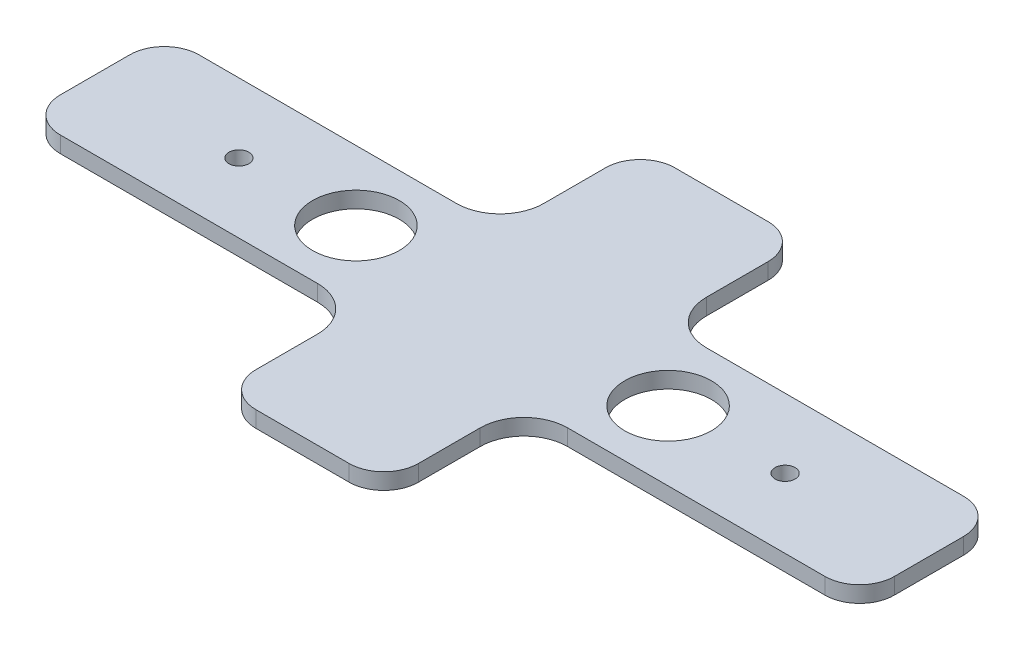
ISO-10303-21;
HEADER;
FILE_DESCRIPTION(('STEP AP214'),'2;1');
FILE_NAME('part.step','',(''),(''),'','','');
FILE_SCHEMA(('AUTOMOTIVE_DESIGN { 1 0 10303 214 1 1 1 1 }'));
ENDSEC;
DATA;
#1=APPLICATION_CONTEXT('core data for automotive mechanical design processes');
#2=APPLICATION_PROTOCOL_DEFINITION('international standard','automotive_design',2000,#1);
#3=PRODUCT_CONTEXT('',#1,'mechanical');
#4=PRODUCT('Part','Part','',(#3));
#5=PRODUCT_RELATED_PRODUCT_CATEGORY('part','',(#4));
#6=PRODUCT_DEFINITION_FORMATION('','',#4);
#7=PRODUCT_DEFINITION_CONTEXT('part definition',#1,'design');
#8=PRODUCT_DEFINITION('design','',#6,#7);
#9=PRODUCT_DEFINITION_SHAPE('','',#8);
#10=(LENGTH_UNIT() NAMED_UNIT(*) SI_UNIT(.MILLI.,.METRE.));
#11=(NAMED_UNIT(*) PLANE_ANGLE_UNIT() SI_UNIT($,.RADIAN.));
#12=(NAMED_UNIT(*) SI_UNIT($,.STERADIAN.) SOLID_ANGLE_UNIT());
#13=UNCERTAINTY_MEASURE_WITH_UNIT(LENGTH_MEASURE(1.E-05),#10,'distance_accuracy_value','');
#14=(GEOMETRIC_REPRESENTATION_CONTEXT(3) GLOBAL_UNCERTAINTY_ASSIGNED_CONTEXT((#13)) GLOBAL_UNIT_ASSIGNED_CONTEXT((#10,
#11,#12)) REPRESENTATION_CONTEXT('',''));
#15=CARTESIAN_POINT('',(0.,0.,0.));
#16=DIRECTION('',(0.,0.,1.));
#17=DIRECTION('',(1.,0.,0.));
#18=AXIS2_PLACEMENT_3D('',#15,#16,#17);
#19=CARTESIAN_POINT('',(0.,90.5002,143.155943707725));
#20=DIRECTION('',(0.,0.,1.));
#21=DIRECTION('',(1.,0.,0.));
#22=AXIS2_PLACEMENT_3D('',#19,#20,#21);
#23=PLANE('',#22);
#24=DIRECTION('',(1.,0.,0.));
#25=VECTOR('',#24,1.);
#26=CARTESIAN_POINT('',(0.,93.472,143.155943707725));
#27=LINE('',#26,#25);
#28=CARTESIAN_POINT('',(-9.32304003720227,93.472,143.155943707725));
#29=VERTEX_POINT('',#28);
#30=CARTESIAN_POINT('',(7.73150051393097,93.472,143.155943707725));
#31=VERTEX_POINT('',#30);
#32=EDGE_CURVE('E273',#29,#31,#27,.T.);
#33=ORIENTED_EDGE('',*,*,#32,.T.);
#34=DIRECTION('',(0.,1.,0.));
#35=VECTOR('',#34,1.);
#36=CARTESIAN_POINT('',(7.73150051393097,90.5002,143.155943707725));
#37=LINE('',#36,#35);
#38=CARTESIAN_POINT('',(7.73150051393097,90.5002,143.155943707725));
#39=VERTEX_POINT('',#38);
#40=EDGE_CURVE('E211',#39,#31,#37,.T.);
#41=ORIENTED_EDGE('',*,*,#40,.F.);
#42=DIRECTION('',(1.,0.,0.));
#43=VECTOR('',#42,1.);
#44=CARTESIAN_POINT('',(0.,90.5002,143.155943707725));
#45=LINE('',#44,#43);
#46=CARTESIAN_POINT('',(-9.32304003720227,90.5002,143.155943707725));
#47=VERTEX_POINT('',#46);
#48=EDGE_CURVE('E210',#47,#39,#45,.T.);
#49=ORIENTED_EDGE('',*,*,#48,.F.);
#50=DIRECTION('',(0.,1.,0.));
#51=VECTOR('',#50,1.);
#52=CARTESIAN_POINT('',(-9.32304003720227,90.5002,143.155943707725));
#53=LINE('',#52,#51);
#54=EDGE_CURVE('E195',#47,#29,#53,.T.);
#55=ORIENTED_EDGE('',*,*,#54,.T.);
#56=EDGE_LOOP('',(#33,#41,#49,#55));
#57=FACE_BOUND('',#56,.T.);
#58=ADVANCED_FACE('F34',(#57),#23,.F.);
#59=CARTESIAN_POINT('',(7.73150051393097,90.5002,149.505943707725));
#60=DIRECTION('',(0.,1.,0.));
#61=DIRECTION('',(0.,0.,1.));
#62=AXIS2_PLACEMENT_3D('',#59,#60,#61);
#63=CYLINDRICAL_SURFACE('',#62,6.35);
#64=CARTESIAN_POINT('',(7.73150051393097,93.472,149.505943707725));
#65=DIRECTION('',(0.,1.,0.));
#66=DIRECTION('',(0.,0.,1.));
#67=AXIS2_PLACEMENT_3D('',#64,#65,#66);
#68=CIRCLE('',#67,6.35);
#69=CARTESIAN_POINT('',(14.081500513931,93.472,149.505943707725));
#70=VERTEX_POINT('',#69);
#71=EDGE_CURVE('E319',#70,#31,#68,.T.);
#72=ORIENTED_EDGE('',*,*,#71,.F.);
#73=DIRECTION('',(0.,1.,0.));
#74=VECTOR('',#73,1.);
#75=CARTESIAN_POINT('',(14.081500513931,90.5002,149.505943707725));
#76=LINE('',#75,#74);
#77=CARTESIAN_POINT('',(14.081500513931,90.5002,149.505943707725));
#78=VERTEX_POINT('',#77);
#79=EDGE_CURVE('E325',#78,#70,#76,.T.);
#80=ORIENTED_EDGE('',*,*,#79,.F.);
#81=CARTESIAN_POINT('',(7.73150051393097,90.5002,149.505943707725));
#82=DIRECTION('',(0.,1.,0.));
#83=DIRECTION('',(0.,0.,1.));
#84=AXIS2_PLACEMENT_3D('',#81,#82,#83);
#85=CIRCLE('',#84,6.35);
#86=EDGE_CURVE('E207',#78,#39,#85,.T.);
#87=ORIENTED_EDGE('',*,*,#86,.T.);
#88=ORIENTED_EDGE('',*,*,#40,.T.);
#89=EDGE_LOOP('',(#72,#80,#87,#88));
#90=FACE_BOUND('',#89,.T.);
#91=ADVANCED_FACE('F435',(#90),#63,.T.);
#92=CARTESIAN_POINT('',(14.081500513931,90.5002,0.));
#93=DIRECTION('',(-1.,0.,0.));
#94=DIRECTION('',(0.,0.,1.));
#95=AXIS2_PLACEMENT_3D('',#92,#93,#94);
#96=PLANE('',#95);
#97=DIRECTION('',(0.,0.,1.));
#98=VECTOR('',#97,1.);
#99=CARTESIAN_POINT('',(14.081500513931,93.472,0.));
#100=LINE('',#99,#98);
#101=CARTESIAN_POINT('',(14.081500513931,93.472,160.805943707725));
#102=VERTEX_POINT('',#101);
#103=EDGE_CURVE('E316',#70,#102,#100,.T.);
#104=ORIENTED_EDGE('',*,*,#103,.T.);
#105=DIRECTION('',(0.,1.,0.));
#106=VECTOR('',#105,1.);
#107=CARTESIAN_POINT('',(14.081500513931,90.5002,160.805943707725));
#108=LINE('',#107,#106);
#109=CARTESIAN_POINT('',(14.081500513931,90.5002,160.805943707725));
#110=VERTEX_POINT('',#109);
#111=EDGE_CURVE('E365',#102,#110,#108,.F.);
#112=ORIENTED_EDGE('',*,*,#111,.T.);
#113=DIRECTION('',(0.,0.,1.));
#114=VECTOR('',#113,1.);
#115=CARTESIAN_POINT('',(14.081500513931,90.5002,0.));
#116=LINE('',#115,#114);
#117=EDGE_CURVE('E262',#78,#110,#116,.T.);
#118=ORIENTED_EDGE('',*,*,#117,.F.);
#119=ORIENTED_EDGE('',*,*,#79,.T.);
#120=EDGE_LOOP('',(#104,#112,#118,#119));
#121=FACE_BOUND('',#120,.T.);
#122=ADVANCED_FACE('F430',(#121),#96,.F.);
#123=CARTESIAN_POINT('',(0.,90.5002,168.805943707725));
#124=DIRECTION('',(0.,0.,1.));
#125=DIRECTION('',(1.,0.,0.));
#126=AXIS2_PLACEMENT_3D('',#123,#124,#125);
#127=PLANE('',#126);
#128=DIRECTION('',(1.,0.,0.));
#129=VECTOR('',#128,1.);
#130=CARTESIAN_POINT('',(0.,90.5002,168.805943707725));
#131=LINE('',#130,#129);
#132=CARTESIAN_POINT('',(22.081500513931,90.5002,168.805943707725));
#133=VERTEX_POINT('',#132);
#134=CARTESIAN_POINT('',(69.2042302383644,90.5002,168.805943707725));
#135=VERTEX_POINT('',#134);
#136=EDGE_CURVE('E260',#133,#135,#131,.T.);
#137=ORIENTED_EDGE('',*,*,#136,.F.);
#138=DIRECTION('',(0.,1.,0.));
#139=VECTOR('',#138,1.);
#140=CARTESIAN_POINT('',(22.081500513931,93.472,168.805943707725));
#141=LINE('',#140,#139);
#142=CARTESIAN_POINT('',(22.081500513931,93.472,168.805943707725));
#143=VERTEX_POINT('',#142);
#144=EDGE_CURVE('E362',#133,#143,#141,.T.);
#145=ORIENTED_EDGE('',*,*,#144,.T.);
#146=DIRECTION('',(1.,0.,0.));
#147=VECTOR('',#146,1.);
#148=CARTESIAN_POINT('',(0.,93.472,168.805943707725));
#149=LINE('',#148,#147);
#150=CARTESIAN_POINT('',(69.2042302383644,93.472,168.805943707725));
#151=VERTEX_POINT('',#150);
#152=EDGE_CURVE('E314',#143,#151,#149,.T.);
#153=ORIENTED_EDGE('',*,*,#152,.T.);
#154=DIRECTION('',(0.,1.,0.));
#155=VECTOR('',#154,1.);
#156=CARTESIAN_POINT('',(69.2042302383644,90.5002,168.805943707725));
#157=LINE('',#156,#155);
#158=EDGE_CURVE('E327',#135,#151,#157,.T.);
#159=ORIENTED_EDGE('',*,*,#158,.F.);
#160=EDGE_LOOP('',(#137,#145,#153,#159));
#161=FACE_BOUND('',#160,.T.);
#162=ADVANCED_FACE('F423',(#161),#127,.F.);
#163=CARTESIAN_POINT('',(69.2042302383644,90.5002,175.155943707725));
#164=DIRECTION('',(0.,1.,0.));
#165=DIRECTION('',(0.,0.,1.));
#166=AXIS2_PLACEMENT_3D('',#163,#164,#165);
#167=CYLINDRICAL_SURFACE('',#166,6.34999999999999);
#168=CARTESIAN_POINT('',(69.2042302383644,93.472,175.155943707725));
#169=DIRECTION('',(0.,1.,0.));
#170=DIRECTION('',(0.,0.,1.));
#171=AXIS2_PLACEMENT_3D('',#168,#169,#170);
#172=CIRCLE('',#171,6.34999999999999);
#173=CARTESIAN_POINT('',(75.5542302383644,93.472,175.155943707725));
#174=VERTEX_POINT('',#173);
#175=EDGE_CURVE('E312',#151,#174,#172,.F.);
#176=ORIENTED_EDGE('',*,*,#175,.T.);
#177=DIRECTION('',(0.,1.,0.));
#178=VECTOR('',#177,1.);
#179=CARTESIAN_POINT('',(75.5542302383644,90.5002,175.155943707725));
#180=LINE('',#179,#178);
#181=CARTESIAN_POINT('',(75.5542302383644,90.5002,175.155943707725));
#182=VERTEX_POINT('',#181);
#183=EDGE_CURVE('E330',#182,#174,#180,.T.);
#184=ORIENTED_EDGE('',*,*,#183,.F.);
#185=CARTESIAN_POINT('',(69.2042302383644,90.5002,175.155943707725));
#186=DIRECTION('',(0.,1.,0.));
#187=DIRECTION('',(0.,0.,1.));
#188=AXIS2_PLACEMENT_3D('',#185,#186,#187);
#189=CIRCLE('',#188,6.34999999999999);
#190=EDGE_CURVE('E258',#135,#182,#189,.F.);
#191=ORIENTED_EDGE('',*,*,#190,.F.);
#192=ORIENTED_EDGE('',*,*,#158,.T.);
#193=EDGE_LOOP('',(#176,#184,#191,#192));
#194=FACE_BOUND('',#193,.T.);
#195=ADVANCED_FACE('F419',(#194),#167,.T.);
#196=CARTESIAN_POINT('',(75.5542302383646,90.5002,0.));
#197=DIRECTION('',(-1.,0.,0.));
#198=DIRECTION('',(0.,0.,1.));
#199=AXIS2_PLACEMENT_3D('',#196,#197,#198);
#200=PLANE('',#199);
#201=DIRECTION('',(0.,0.,1.));
#202=VECTOR('',#201,1.);
#203=CARTESIAN_POINT('',(75.5542302383646,93.472,0.));
#204=LINE('',#203,#202);
#205=CARTESIAN_POINT('',(75.5542302383644,93.472,187.855943707725));
#206=VERTEX_POINT('',#205);
#207=EDGE_CURVE('E310',#174,#206,#204,.T.);
#208=ORIENTED_EDGE('',*,*,#207,.T.);
#209=DIRECTION('',(0.,1.,0.));
#210=VECTOR('',#209,1.);
#211=CARTESIAN_POINT('',(75.5542302383644,90.5002,187.855943707725));
#212=LINE('',#211,#210);
#213=CARTESIAN_POINT('',(75.5542302383644,90.5002,187.855943707725));
#214=VERTEX_POINT('',#213);
#215=EDGE_CURVE('E333',#214,#206,#212,.T.);
#216=ORIENTED_EDGE('',*,*,#215,.F.);
#217=DIRECTION('',(0.,0.,1.));
#218=VECTOR('',#217,1.);
#219=CARTESIAN_POINT('',(75.5542302383646,90.5002,0.));
#220=LINE('',#219,#218);
#221=EDGE_CURVE('E256',#182,#214,#220,.T.);
#222=ORIENTED_EDGE('',*,*,#221,.F.);
#223=ORIENTED_EDGE('',*,*,#183,.T.);
#224=EDGE_LOOP('',(#208,#216,#222,#223));
#225=FACE_BOUND('',#224,.T.);
#226=ADVANCED_FACE('F414',(#225),#200,.F.);
#227=CARTESIAN_POINT('',(69.2042302383644,90.5002,187.855943707725));
#228=DIRECTION('',(0.,1.,0.));
#229=DIRECTION('',(0.,0.,1.));
#230=AXIS2_PLACEMENT_3D('',#227,#228,#229);
#231=CYLINDRICAL_SURFACE('',#230,6.34999999999999);
#232=CARTESIAN_POINT('',(69.2042302383644,93.472,187.855943707725));
#233=DIRECTION('',(0.,1.,0.));
#234=DIRECTION('',(0.,0.,1.));
#235=AXIS2_PLACEMENT_3D('',#232,#233,#234);
#236=CIRCLE('',#235,6.34999999999999);
#237=CARTESIAN_POINT('',(69.2042302383644,93.472,194.205943707725));
#238=VERTEX_POINT('',#237);
#239=EDGE_CURVE('E308',#206,#238,#236,.F.);
#240=ORIENTED_EDGE('',*,*,#239,.T.);
#241=DIRECTION('',(0.,1.,0.));
#242=VECTOR('',#241,1.);
#243=CARTESIAN_POINT('',(69.2042302383644,90.5002,194.205943707725));
#244=LINE('',#243,#242);
#245=CARTESIAN_POINT('',(69.2042302383644,90.5002,194.205943707725));
#246=VERTEX_POINT('',#245);
#247=EDGE_CURVE('E336',#246,#238,#244,.T.);
#248=ORIENTED_EDGE('',*,*,#247,.F.);
#249=CARTESIAN_POINT('',(69.2042302383644,90.5002,187.855943707725));
#250=DIRECTION('',(0.,1.,0.));
#251=DIRECTION('',(0.,0.,1.));
#252=AXIS2_PLACEMENT_3D('',#249,#250,#251);
#253=CIRCLE('',#252,6.34999999999999);
#254=EDGE_CURVE('E254',#214,#246,#253,.F.);
#255=ORIENTED_EDGE('',*,*,#254,.F.);
#256=ORIENTED_EDGE('',*,*,#215,.T.);
#257=EDGE_LOOP('',(#240,#248,#255,#256));
#258=FACE_BOUND('',#257,.T.);
#259=ADVANCED_FACE('F408',(#258),#231,.T.);
#260=CARTESIAN_POINT('',(0.,90.5002,194.205943707725));
#261=DIRECTION('',(0.,0.,-1.));
#262=DIRECTION('',(-1.,0.,0.));
#263=AXIS2_PLACEMENT_3D('',#260,#261,#262);
#264=PLANE('',#263);
#265=DIRECTION('',(-1.,0.,0.));
#266=VECTOR('',#265,1.);
#267=CARTESIAN_POINT('',(0.,93.472,194.205943707725));
#268=LINE('',#267,#266);
#269=CARTESIAN_POINT('',(22.081500513931,93.472,194.205943707725));
#270=VERTEX_POINT('',#269);
#271=EDGE_CURVE('E305',#238,#270,#268,.T.);
#272=ORIENTED_EDGE('',*,*,#271,.T.);
#273=DIRECTION('',(0.,1.,0.));
#274=VECTOR('',#273,1.);
#275=CARTESIAN_POINT('',(22.081500513931,90.5002,194.205943707725));
#276=LINE('',#275,#274);
#277=CARTESIAN_POINT('',(22.081500513931,90.5002,194.205943707725));
#278=VERTEX_POINT('',#277);
#279=EDGE_CURVE('E370',#270,#278,#276,.F.);
#280=ORIENTED_EDGE('',*,*,#279,.T.);
#281=DIRECTION('',(-1.,0.,0.));
#282=VECTOR('',#281,1.);
#283=CARTESIAN_POINT('',(0.,90.5002,194.205943707725));
#284=LINE('',#283,#282);
#285=EDGE_CURVE('E251',#246,#278,#284,.T.);
#286=ORIENTED_EDGE('',*,*,#285,.F.);
#287=ORIENTED_EDGE('',*,*,#247,.T.);
#288=EDGE_LOOP('',(#272,#280,#286,#287));
#289=FACE_BOUND('',#288,.T.);
#290=ADVANCED_FACE('F404',(#289),#264,.F.);
#291=CARTESIAN_POINT('',(14.0815005139309,90.5002,0.));
#292=DIRECTION('',(-1.,0.,0.));
#293=DIRECTION('',(0.,0.,1.));
#294=AXIS2_PLACEMENT_3D('',#291,#292,#293);
#295=PLANE('',#294);
#296=DIRECTION('',(0.,0.,1.));
#297=VECTOR('',#296,1.);
#298=CARTESIAN_POINT('',(14.0815005139309,90.5002,0.));
#299=LINE('',#298,#297);
#300=CARTESIAN_POINT('',(14.081500513931,90.5002,202.205943707725));
#301=VERTEX_POINT('',#300);
#302=CARTESIAN_POINT('',(14.081500513931,90.5002,213.505943707725));
#303=VERTEX_POINT('',#302);
#304=EDGE_CURVE('E249',#301,#303,#299,.T.);
#305=ORIENTED_EDGE('',*,*,#304,.F.);
#306=DIRECTION('',(0.,1.,0.));
#307=VECTOR('',#306,1.);
#308=CARTESIAN_POINT('',(14.081500513931,93.472,202.205943707725));
#309=LINE('',#308,#307);
#310=CARTESIAN_POINT('',(14.081500513931,93.472,202.205943707725));
#311=VERTEX_POINT('',#310);
#312=EDGE_CURVE('E367',#301,#311,#309,.T.);
#313=ORIENTED_EDGE('',*,*,#312,.T.);
#314=DIRECTION('',(0.,0.,1.));
#315=VECTOR('',#314,1.);
#316=CARTESIAN_POINT('',(14.0815005139309,93.472,0.));
#317=LINE('',#316,#315);
#318=CARTESIAN_POINT('',(14.081500513931,93.472,213.505943707725));
#319=VERTEX_POINT('',#318);
#320=EDGE_CURVE('E303',#311,#319,#317,.T.);
#321=ORIENTED_EDGE('',*,*,#320,.T.);
#322=DIRECTION('',(0.,1.,0.));
#323=VECTOR('',#322,1.);
#324=CARTESIAN_POINT('',(14.081500513931,90.5002,213.505943707725));
#325=LINE('',#324,#323);
#326=EDGE_CURVE('E339',#303,#319,#325,.T.);
#327=ORIENTED_EDGE('',*,*,#326,.F.);
#328=EDGE_LOOP('',(#305,#313,#321,#327));
#329=FACE_BOUND('',#328,.T.);
#330=ADVANCED_FACE('F395',(#329),#295,.F.);
#331=CARTESIAN_POINT('',(7.73150051393097,90.5002,213.505943707725));
#332=DIRECTION('',(0.,1.,0.));
#333=DIRECTION('',(0.,0.,1.));
#334=AXIS2_PLACEMENT_3D('',#331,#332,#333);
#335=CYLINDRICAL_SURFACE('',#334,6.35);
#336=CARTESIAN_POINT('',(7.73150051393097,93.472,213.505943707725));
#337=DIRECTION('',(0.,1.,0.));
#338=DIRECTION('',(0.,0.,1.));
#339=AXIS2_PLACEMENT_3D('',#336,#337,#338);
#340=CIRCLE('',#339,6.35);
#341=CARTESIAN_POINT('',(7.73150051393097,93.472,219.855943707725));
#342=VERTEX_POINT('',#341);
#343=EDGE_CURVE('E300',#319,#342,#340,.F.);
#344=ORIENTED_EDGE('',*,*,#343,.T.);
#345=DIRECTION('',(0.,1.,0.));
#346=VECTOR('',#345,1.);
#347=CARTESIAN_POINT('',(7.73150051393097,90.5002,219.855943707725));
#348=LINE('',#347,#346);
#349=CARTESIAN_POINT('',(7.73150051393097,90.5002,219.855943707725));
#350=VERTEX_POINT('',#349);
#351=EDGE_CURVE('E342',#350,#342,#348,.T.);
#352=ORIENTED_EDGE('',*,*,#351,.F.);
#353=CARTESIAN_POINT('',(7.73150051393097,90.5002,213.505943707725));
#354=DIRECTION('',(0.,1.,0.));
#355=DIRECTION('',(0.,0.,1.));
#356=AXIS2_PLACEMENT_3D('',#353,#354,#355);
#357=CIRCLE('',#356,6.35);
#358=EDGE_CURVE('E247',#303,#350,#357,.F.);
#359=ORIENTED_EDGE('',*,*,#358,.F.);
#360=ORIENTED_EDGE('',*,*,#326,.T.);
#361=EDGE_LOOP('',(#344,#352,#359,#360));
#362=FACE_BOUND('',#361,.T.);
#363=ADVANCED_FACE('F478',(#362),#335,.T.);
#364=CARTESIAN_POINT('',(0.,90.5002,219.855943707725));
#365=DIRECTION('',(0.,0.,1.));
#366=DIRECTION('',(1.,0.,0.));
#367=AXIS2_PLACEMENT_3D('',#364,#365,#366);
#368=PLANE('',#367);
#369=DIRECTION('',(1.,0.,0.));
#370=VECTOR('',#369,1.);
#371=CARTESIAN_POINT('',(0.,93.472,219.855943707725));
#372=LINE('',#371,#370);
#373=CARTESIAN_POINT('',(-9.32304003720227,93.472,219.855943707725));
#374=VERTEX_POINT('',#373);
#375=EDGE_CURVE('E297',#374,#342,#372,.T.);
#376=ORIENTED_EDGE('',*,*,#375,.F.);
#377=DIRECTION('',(0.,1.,0.));
#378=VECTOR('',#377,1.);
#379=CARTESIAN_POINT('',(-9.32304003720227,90.5002,219.855943707725));
#380=LINE('',#379,#378);
#381=CARTESIAN_POINT('',(-9.32304003720227,90.5002,219.855943707725));
#382=VERTEX_POINT('',#381);
#383=EDGE_CURVE('E344',#382,#374,#380,.T.);
#384=ORIENTED_EDGE('',*,*,#383,.F.);
#385=DIRECTION('',(1.,0.,0.));
#386=VECTOR('',#385,1.);
#387=CARTESIAN_POINT('',(0.,90.5002,219.855943707725));
#388=LINE('',#387,#386);
#389=EDGE_CURVE('E244',#382,#350,#388,.T.);
#390=ORIENTED_EDGE('',*,*,#389,.T.);
#391=ORIENTED_EDGE('',*,*,#351,.T.);
#392=EDGE_LOOP('',(#376,#384,#390,#391));
#393=FACE_BOUND('',#392,.T.);
#394=ADVANCED_FACE('F475',(#393),#368,.T.);
#395=CARTESIAN_POINT('',(-9.32304003720227,90.5002,213.505943707725));
#396=DIRECTION('',(0.,1.,0.));
#397=DIRECTION('',(0.,0.,1.));
#398=AXIS2_PLACEMENT_3D('',#395,#396,#397);
#399=CYLINDRICAL_SURFACE('',#398,6.35);
#400=CARTESIAN_POINT('',(-9.32304003720227,93.472,213.505943707725));
#401=DIRECTION('',(0.,1.,0.));
#402=DIRECTION('',(0.,0.,1.));
#403=AXIS2_PLACEMENT_3D('',#400,#401,#402);
#404=CIRCLE('',#403,6.35);
#405=CARTESIAN_POINT('',(-15.6730400372023,93.472,213.505943707725));
#406=VERTEX_POINT('',#405);
#407=EDGE_CURVE('E294',#406,#374,#404,.T.);
#408=ORIENTED_EDGE('',*,*,#407,.F.);
#409=DIRECTION('',(0.,1.,0.));
#410=VECTOR('',#409,1.);
#411=CARTESIAN_POINT('',(-15.6730400372023,90.5002,213.505943707725));
#412=LINE('',#411,#410);
#413=CARTESIAN_POINT('',(-15.6730400372023,90.5002,213.505943707725));
#414=VERTEX_POINT('',#413);
#415=EDGE_CURVE('E346',#414,#406,#412,.T.);
#416=ORIENTED_EDGE('',*,*,#415,.F.);
#417=CARTESIAN_POINT('',(-9.32304003720227,90.5002,213.505943707725));
#418=DIRECTION('',(0.,1.,0.));
#419=DIRECTION('',(0.,0.,1.));
#420=AXIS2_PLACEMENT_3D('',#417,#418,#419);
#421=CIRCLE('',#420,6.35);
#422=EDGE_CURVE('E241',#414,#382,#421,.T.);
#423=ORIENTED_EDGE('',*,*,#422,.T.);
#424=ORIENTED_EDGE('',*,*,#383,.T.);
#425=EDGE_LOOP('',(#408,#416,#423,#424));
#426=FACE_BOUND('',#425,.T.);
#427=ADVANCED_FACE('F472',(#426),#399,.T.);
#428=CARTESIAN_POINT('',(-15.6730400372023,90.5002,0.));
#429=DIRECTION('',(1.,0.,0.));
#430=DIRECTION('',(0.,0.,-1.));
#431=AXIS2_PLACEMENT_3D('',#428,#429,#430);
#432=PLANE('',#431);
#433=DIRECTION('',(0.,0.,-1.));
#434=VECTOR('',#433,1.);
#435=CARTESIAN_POINT('',(-15.6730400372023,93.472,0.));
#436=LINE('',#435,#434);
#437=CARTESIAN_POINT('',(-15.6730400372023,93.472,202.205943707725));
#438=VERTEX_POINT('',#437);
#439=EDGE_CURVE('E292',#406,#438,#436,.T.);
#440=ORIENTED_EDGE('',*,*,#439,.T.);
#441=DIRECTION('',(0.,1.,0.));
#442=VECTOR('',#441,1.);
#443=CARTESIAN_POINT('',(-15.6730400372023,90.5002,202.205943707725));
#444=LINE('',#443,#442);
#445=CARTESIAN_POINT('',(-15.6730400372023,90.5002,202.205943707725));
#446=VERTEX_POINT('',#445);
#447=EDGE_CURVE('E49',#438,#446,#444,.F.);
#448=ORIENTED_EDGE('',*,*,#447,.T.);
#449=DIRECTION('',(0.,0.,-1.));
#450=VECTOR('',#449,1.);
#451=CARTESIAN_POINT('',(-15.6730400372023,90.5002,0.));
#452=LINE('',#451,#450);
#453=EDGE_CURVE('E239',#414,#446,#452,.T.);
#454=ORIENTED_EDGE('',*,*,#453,.F.);
#455=ORIENTED_EDGE('',*,*,#415,.T.);
#456=EDGE_LOOP('',(#440,#448,#454,#455));
#457=FACE_BOUND('',#456,.T.);
#458=ADVANCED_FACE('F469',(#457),#432,.F.);
#459=CARTESIAN_POINT('',(0.,90.5002,194.205943707725));
#460=DIRECTION('',(0.,0.,-1.));
#461=DIRECTION('',(-1.,0.,0.));
#462=AXIS2_PLACEMENT_3D('',#459,#460,#461);
#463=PLANE('',#462);
#464=DIRECTION('',(-1.,0.,0.));
#465=VECTOR('',#464,1.);
#466=CARTESIAN_POINT('',(0.,90.5002,194.205943707725));
#467=LINE('',#466,#465);
#468=CARTESIAN_POINT('',(-23.6730400372023,90.5002,194.205943707725));
#469=VERTEX_POINT('',#468);
#470=CARTESIAN_POINT('',(-70.7957697616356,90.5002,194.205943707725));
#471=VERTEX_POINT('',#470);
#472=EDGE_CURVE('E237',#469,#471,#467,.T.);
#473=ORIENTED_EDGE('',*,*,#472,.F.);
#474=DIRECTION('',(0.,1.,0.));
#475=VECTOR('',#474,1.);
#476=CARTESIAN_POINT('',(-23.6730400372023,93.472,194.205943707725));
#477=LINE('',#476,#475);
#478=CARTESIAN_POINT('',(-23.6730400372023,93.472,194.205943707725));
#479=VERTEX_POINT('',#478);
#480=EDGE_CURVE('E372',#469,#479,#477,.T.);
#481=ORIENTED_EDGE('',*,*,#480,.T.);
#482=DIRECTION('',(-1.,0.,0.));
#483=VECTOR('',#482,1.);
#484=CARTESIAN_POINT('',(0.,93.472,194.205943707725));
#485=LINE('',#484,#483);
#486=CARTESIAN_POINT('',(-70.7957697616356,93.472,194.205943707725));
#487=VERTEX_POINT('',#486);
#488=EDGE_CURVE('E290',#479,#487,#485,.T.);
#489=ORIENTED_EDGE('',*,*,#488,.T.);
#490=DIRECTION('',(0.,1.,0.));
#491=VECTOR('',#490,1.);
#492=CARTESIAN_POINT('',(-70.7957697616356,90.5002,194.205943707725));
#493=LINE('',#492,#491);
#494=EDGE_CURVE('E348',#471,#487,#493,.T.);
#495=ORIENTED_EDGE('',*,*,#494,.F.);
#496=EDGE_LOOP('',(#473,#481,#489,#495));
#497=FACE_BOUND('',#496,.T.);
#498=ADVANCED_FACE('F463',(#497),#463,.F.);
#499=CARTESIAN_POINT('',(-70.7957697616356,90.5002,187.855943707725));
#500=DIRECTION('',(0.,1.,0.));
#501=DIRECTION('',(0.,0.,1.));
#502=AXIS2_PLACEMENT_3D('',#499,#500,#501);
#503=CYLINDRICAL_SURFACE('',#502,6.34999999999999);
#504=CARTESIAN_POINT('',(-70.7957697616356,93.472,187.855943707725));
#505=DIRECTION('',(0.,1.,0.));
#506=DIRECTION('',(0.,0.,1.));
#507=AXIS2_PLACEMENT_3D('',#504,#505,#506);
#508=CIRCLE('',#507,6.34999999999999);
#509=CARTESIAN_POINT('',(-77.1457697616356,93.472,187.855943707725));
#510=VERTEX_POINT('',#509);
#511=EDGE_CURVE('E287',#510,#487,#508,.T.);
#512=ORIENTED_EDGE('',*,*,#511,.F.);
#513=DIRECTION('',(0.,1.,0.));
#514=VECTOR('',#513,1.);
#515=CARTESIAN_POINT('',(-77.1457697616356,90.5002,187.855943707725));
#516=LINE('',#515,#514);
#517=CARTESIAN_POINT('',(-77.1457697616356,90.5002,187.855943707725));
#518=VERTEX_POINT('',#517);
#519=EDGE_CURVE('E351',#518,#510,#516,.T.);
#520=ORIENTED_EDGE('',*,*,#519,.F.);
#521=CARTESIAN_POINT('',(-70.7957697616356,90.5002,187.855943707725));
#522=DIRECTION('',(0.,1.,0.));
#523=DIRECTION('',(0.,0.,1.));
#524=AXIS2_PLACEMENT_3D('',#521,#522,#523);
#525=CIRCLE('',#524,6.34999999999999);
#526=EDGE_CURVE('E234',#518,#471,#525,.T.);
#527=ORIENTED_EDGE('',*,*,#526,.T.);
#528=ORIENTED_EDGE('',*,*,#494,.T.);
#529=EDGE_LOOP('',(#512,#520,#527,#528));
#530=FACE_BOUND('',#529,.T.);
#531=ADVANCED_FACE('F459',(#530),#503,.T.);
#532=CARTESIAN_POINT('',(-77.1457697616356,90.5002,0.));
#533=DIRECTION('',(-1.,0.,0.));
#534=DIRECTION('',(0.,0.,1.));
#535=AXIS2_PLACEMENT_3D('',#532,#533,#534);
#536=PLANE('',#535);
#537=DIRECTION('',(0.,0.,1.));
#538=VECTOR('',#537,1.);
#539=CARTESIAN_POINT('',(-77.1457697616356,93.472,0.));
#540=LINE('',#539,#538);
#541=CARTESIAN_POINT('',(-77.1457697616356,93.472,175.155943707725));
#542=VERTEX_POINT('',#541);
#543=EDGE_CURVE('E284',#542,#510,#540,.T.);
#544=ORIENTED_EDGE('',*,*,#543,.F.);
#545=DIRECTION('',(0.,1.,0.));
#546=VECTOR('',#545,1.);
#547=CARTESIAN_POINT('',(-77.1457697616356,90.5002,175.155943707725));
#548=LINE('',#547,#546);
#549=CARTESIAN_POINT('',(-77.1457697616356,90.5002,175.155943707725));
#550=VERTEX_POINT('',#549);
#551=EDGE_CURVE('E353',#550,#542,#548,.T.);
#552=ORIENTED_EDGE('',*,*,#551,.F.);
#553=DIRECTION('',(0.,0.,1.));
#554=VECTOR('',#553,1.);
#555=CARTESIAN_POINT('',(-77.1457697616356,90.5002,0.));
#556=LINE('',#555,#554);
#557=EDGE_CURVE('E231',#550,#518,#556,.T.);
#558=ORIENTED_EDGE('',*,*,#557,.T.);
#559=ORIENTED_EDGE('',*,*,#519,.T.);
#560=EDGE_LOOP('',(#544,#552,#558,#559));
#561=FACE_BOUND('',#560,.T.);
#562=ADVANCED_FACE('F457',(#561),#536,.T.);
#563=CARTESIAN_POINT('',(-70.7957697616356,90.5002,175.155943707725));
#564=DIRECTION('',(0.,1.,0.));
#565=DIRECTION('',(0.,0.,1.));
#566=AXIS2_PLACEMENT_3D('',#563,#564,#565);
#567=CYLINDRICAL_SURFACE('',#566,6.34999999999999);
#568=CARTESIAN_POINT('',(-70.7957697616356,93.472,175.155943707725));
#569=DIRECTION('',(0.,1.,0.));
#570=DIRECTION('',(0.,0.,1.));
#571=AXIS2_PLACEMENT_3D('',#568,#569,#570);
#572=CIRCLE('',#571,6.34999999999999);
#573=CARTESIAN_POINT('',(-70.7957697616356,93.472,168.805943707725));
#574=VERTEX_POINT('',#573);
#575=EDGE_CURVE('E281',#574,#542,#572,.T.);
#576=ORIENTED_EDGE('',*,*,#575,.F.);
#577=DIRECTION('',(0.,1.,0.));
#578=VECTOR('',#577,1.);
#579=CARTESIAN_POINT('',(-70.7957697616356,90.5002,168.805943707725));
#580=LINE('',#579,#578);
#581=CARTESIAN_POINT('',(-70.7957697616356,90.5002,168.805943707725));
#582=VERTEX_POINT('',#581);
#583=EDGE_CURVE('E355',#582,#574,#580,.T.);
#584=ORIENTED_EDGE('',*,*,#583,.F.);
#585=CARTESIAN_POINT('',(-70.7957697616356,90.5002,175.155943707725));
#586=DIRECTION('',(0.,1.,0.));
#587=DIRECTION('',(0.,0.,1.));
#588=AXIS2_PLACEMENT_3D('',#585,#586,#587);
#589=CIRCLE('',#588,6.34999999999999);
#590=EDGE_CURVE('E228',#582,#550,#589,.T.);
#591=ORIENTED_EDGE('',*,*,#590,.T.);
#592=ORIENTED_EDGE('',*,*,#551,.T.);
#593=EDGE_LOOP('',(#576,#584,#591,#592));
#594=FACE_BOUND('',#593,.T.);
#595=ADVANCED_FACE('F453',(#594),#567,.T.);
#596=CARTESIAN_POINT('',(0.,90.5002,168.805943707725));
#597=DIRECTION('',(0.,0.,1.));
#598=DIRECTION('',(1.,0.,0.));
#599=AXIS2_PLACEMENT_3D('',#596,#597,#598);
#600=PLANE('',#599);
#601=DIRECTION('',(1.,0.,0.));
#602=VECTOR('',#601,1.);
#603=CARTESIAN_POINT('',(0.,93.472,168.805943707725));
#604=LINE('',#603,#602);
#605=CARTESIAN_POINT('',(-23.6730400372023,93.472,168.805943707725));
#606=VERTEX_POINT('',#605);
#607=EDGE_CURVE('E278',#574,#606,#604,.T.);
#608=ORIENTED_EDGE('',*,*,#607,.T.);
#609=DIRECTION('',(0.,1.,0.));
#610=VECTOR('',#609,1.);
#611=CARTESIAN_POINT('',(-23.6730400372023,90.5002,168.805943707725));
#612=LINE('',#611,#610);
#613=CARTESIAN_POINT('',(-23.6730400372023,90.5002,168.805943707725));
#614=VERTEX_POINT('',#613);
#615=EDGE_CURVE('E360',#606,#614,#612,.F.);
#616=ORIENTED_EDGE('',*,*,#615,.T.);
#617=DIRECTION('',(1.,0.,0.));
#618=VECTOR('',#617,1.);
#619=CARTESIAN_POINT('',(0.,90.5002,168.805943707725));
#620=LINE('',#619,#618);
#621=EDGE_CURVE('E222',#582,#614,#620,.T.);
#622=ORIENTED_EDGE('',*,*,#621,.F.);
#623=ORIENTED_EDGE('',*,*,#583,.T.);
#624=EDGE_LOOP('',(#608,#616,#622,#623));
#625=FACE_BOUND('',#624,.T.);
#626=ADVANCED_FACE('F447',(#625),#600,.F.);
#627=CARTESIAN_POINT('',(-15.6730400372023,90.5002,0.));
#628=DIRECTION('',(1.,0.,0.));
#629=DIRECTION('',(0.,0.,-1.));
#630=AXIS2_PLACEMENT_3D('',#627,#628,#629);
#631=PLANE('',#630);
#632=DIRECTION('',(0.,0.,-1.));
#633=VECTOR('',#632,1.);
#634=CARTESIAN_POINT('',(-15.6730400372023,90.5002,0.));
#635=LINE('',#634,#633);
#636=CARTESIAN_POINT('',(-15.6730400372023,90.5002,160.805943707725));
#637=VERTEX_POINT('',#636);
#638=CARTESIAN_POINT('',(-15.6730400372023,90.5002,149.505943707725));
#639=VERTEX_POINT('',#638);
#640=EDGE_CURVE('E219',#637,#639,#635,.T.);
#641=ORIENTED_EDGE('',*,*,#640,.F.);
#642=DIRECTION('',(0.,1.,0.));
#643=VECTOR('',#642,1.);
#644=CARTESIAN_POINT('',(-15.6730400372023,93.472,160.805943707725));
#645=LINE('',#644,#643);
#646=CARTESIAN_POINT('',(-15.6730400372023,93.472,160.805943707725));
#647=VERTEX_POINT('',#646);
#648=EDGE_CURVE('E324',#637,#647,#645,.T.);
#649=ORIENTED_EDGE('',*,*,#648,.T.);
#650=DIRECTION('',(0.,0.,-1.));
#651=VECTOR('',#650,1.);
#652=CARTESIAN_POINT('',(-15.6730400372023,93.472,0.));
#653=LINE('',#652,#651);
#654=CARTESIAN_POINT('',(-15.6730400372023,93.472,149.505943707725));
#655=VERTEX_POINT('',#654);
#656=EDGE_CURVE('E276',#647,#655,#653,.T.);
#657=ORIENTED_EDGE('',*,*,#656,.T.);
#658=DIRECTION('',(0.,1.,0.));
#659=VECTOR('',#658,1.);
#660=CARTESIAN_POINT('',(-15.6730400372023,90.5002,149.505943707725));
#661=LINE('',#660,#659);
#662=EDGE_CURVE('E206',#639,#655,#661,.T.);
#663=ORIENTED_EDGE('',*,*,#662,.F.);
#664=EDGE_LOOP('',(#641,#649,#657,#663));
#665=FACE_BOUND('',#664,.T.);
#666=ADVANCED_FACE('F439',(#665),#631,.F.);
#667=CARTESIAN_POINT('',(-29.3707697616357,90.5002,181.505943707726));
#668=DIRECTION('',(0.,1.,0.));
#669=DIRECTION('',(0.,0.,1.));
#670=AXIS2_PLACEMENT_3D('',#667,#668,#669);
#671=CYLINDRICAL_SURFACE('',#670,7.93749999999996);
#672=CARTESIAN_POINT('',(-29.3707697616357,90.5002,181.505943707726));
#673=DIRECTION('',(0.,1.,0.));
#674=DIRECTION('',(0.,0.,1.));
#675=AXIS2_PLACEMENT_3D('',#672,#673,#674);
#676=CIRCLE('',#675,7.93749999999996);
#677=CARTESIAN_POINT('',(-29.3707697616357,90.5002,189.443443707726));
#678=VERTEX_POINT('',#677);
#679=EDGE_CURVE('E215',#678,#678,#676,.T.);
#680=ORIENTED_EDGE('',*,*,#679,.F.);
#681=EDGE_LOOP('',(#680));
#682=FACE_BOUND('',#681,.T.);
#683=CARTESIAN_POINT('',(-29.3707697616357,93.472,181.505943707726));
#684=DIRECTION('',(0.,1.,0.));
#685=DIRECTION('',(0.,0.,1.));
#686=AXIS2_PLACEMENT_3D('',#683,#684,#685);
#687=CIRCLE('',#686,7.93749999999996);
#688=CARTESIAN_POINT('',(-29.3707697616357,93.472,189.443443707726));
#689=VERTEX_POINT('',#688);
#690=EDGE_CURVE('E269',#689,#689,#687,.T.);
#691=ORIENTED_EDGE('',*,*,#690,.T.);
#692=EDGE_LOOP('',(#691));
#693=FACE_BOUND('',#692,.T.);
#694=ADVANCED_FACE('F496',(#682,#693),#671,.F.);
#695=CARTESIAN_POINT('',(27.7792302383642,90.5002,181.505943707726));
#696=DIRECTION('',(0.,1.,0.));
#697=DIRECTION('',(0.,0.,1.));
#698=AXIS2_PLACEMENT_3D('',#695,#696,#697);
#699=CYLINDRICAL_SURFACE('',#698,7.93750000000001);
#700=CARTESIAN_POINT('',(27.7792302383642,90.5002,181.505943707726));
#701=DIRECTION('',(0.,1.,0.));
#702=DIRECTION('',(0.,0.,1.));
#703=AXIS2_PLACEMENT_3D('',#700,#701,#702);
#704=CIRCLE('',#703,7.93750000000001);
#705=CARTESIAN_POINT('',(27.7792302383642,90.5002,189.443443707726));
#706=VERTEX_POINT('',#705);
#707=EDGE_CURVE('E322',#706,#706,#704,.T.);
#708=ORIENTED_EDGE('',*,*,#707,.F.);
#709=EDGE_LOOP('',(#708));
#710=FACE_BOUND('',#709,.T.);
#711=CARTESIAN_POINT('',(27.7792302383642,93.472,181.505943707726));
#712=DIRECTION('',(0.,1.,0.));
#713=DIRECTION('',(0.,0.,1.));
#714=AXIS2_PLACEMENT_3D('',#711,#712,#713);
#715=CIRCLE('',#714,7.93750000000001);
#716=CARTESIAN_POINT('',(27.7792302383642,93.472,189.443443707726));
#717=VERTEX_POINT('',#716);
#718=EDGE_CURVE('E266',#717,#717,#715,.T.);
#719=ORIENTED_EDGE('',*,*,#718,.T.);
#720=EDGE_LOOP('',(#719));
#721=FACE_BOUND('',#720,.T.);
#722=ADVANCED_FACE('F499',(#710,#721),#699,.F.);
#723=CARTESIAN_POINT('',(-9.32304003720227,90.5002,149.505943707725));
#724=DIRECTION('',(0.,1.,0.));
#725=DIRECTION('',(0.,0.,1.));
#726=AXIS2_PLACEMENT_3D('',#723,#724,#725);
#727=CYLINDRICAL_SURFACE('',#726,6.35);
#728=CARTESIAN_POINT('',(-9.32304003720227,93.472,149.505943707725));
#729=DIRECTION('',(0.,1.,0.));
#730=DIRECTION('',(0.,0.,1.));
#731=AXIS2_PLACEMENT_3D('',#728,#729,#730);
#732=CIRCLE('',#731,6.35);
#733=EDGE_CURVE('E202',#29,#655,#732,.T.);
#734=ORIENTED_EDGE('',*,*,#733,.F.);
#735=ORIENTED_EDGE('',*,*,#54,.F.);
#736=CARTESIAN_POINT('',(-9.32304003720227,90.5002,149.505943707725));
#737=DIRECTION('',(0.,1.,0.));
#738=DIRECTION('',(0.,0.,1.));
#739=AXIS2_PLACEMENT_3D('',#736,#737,#738);
#740=CIRCLE('',#739,6.35);
#741=EDGE_CURVE('E200',#47,#639,#740,.T.);
#742=ORIENTED_EDGE('',*,*,#741,.T.);
#743=ORIENTED_EDGE('',*,*,#662,.T.);
#744=EDGE_LOOP('',(#734,#735,#742,#743));
#745=FACE_BOUND('',#744,.T.);
#746=ADVANCED_FACE('F197',(#745),#727,.T.);
#747=CARTESIAN_POINT('',(0.,90.5002,0.));
#748=DIRECTION('',(0.,1.,0.));
#749=DIRECTION('',(0.,0.,1.));
#750=AXIS2_PLACEMENT_3D('',#747,#748,#749);
#751=PLANE('',#750);
#752=CARTESIAN_POINT('',(49.2042302383644,90.5002,181.505943707725));
#753=DIRECTION('',(0.,1.,0.));
#754=DIRECTION('',(0.,0.,1.));
#755=AXIS2_PLACEMENT_3D('',#752,#753,#754);
#756=CIRCLE('',#755,1.8288);
#757=CARTESIAN_POINT('',(49.2042302383644,90.5002,183.334743707725));
#758=VERTEX_POINT('',#757);
#759=EDGE_CURVE('E270',#758,#758,#756,.T.);
#760=ORIENTED_EDGE('',*,*,#759,.T.);
#761=EDGE_LOOP('',(#760));
#762=FACE_BOUND('',#761,.T.);
#763=CARTESIAN_POINT('',(-50.7957697616357,90.5002,181.505943707725));
#764=DIRECTION('',(0.,1.,0.));
#765=DIRECTION('',(0.,0.,1.));
#766=AXIS2_PLACEMENT_3D('',#763,#764,#765);
#767=CIRCLE('',#766,1.8288);
#768=CARTESIAN_POINT('',(-50.7957697616357,90.5002,183.334743707725));
#769=VERTEX_POINT('',#768);
#770=EDGE_CURVE('E742',#769,#769,#767,.T.);
#771=ORIENTED_EDGE('',*,*,#770,.T.);
#772=EDGE_LOOP('',(#771));
#773=FACE_BOUND('',#772,.T.);
#774=ORIENTED_EDGE('',*,*,#707,.T.);
#775=EDGE_LOOP('',(#774));
#776=FACE_BOUND('',#775,.T.);
#777=ORIENTED_EDGE('',*,*,#679,.T.);
#778=EDGE_LOOP('',(#777));
#779=FACE_BOUND('',#778,.T.);
#780=ORIENTED_EDGE('',*,*,#48,.T.);
#781=ORIENTED_EDGE('',*,*,#86,.F.);
#782=ORIENTED_EDGE('',*,*,#117,.T.);
#783=CARTESIAN_POINT('',(22.081500513931,90.5002,160.805943707725));
#784=DIRECTION('',(0.,1.,0.));
#785=DIRECTION('',(0.,0.,1.));
#786=AXIS2_PLACEMENT_3D('',#783,#784,#785);
#787=CIRCLE('',#786,8.);
#788=EDGE_CURVE('E382',#110,#133,#787,.T.);
#789=ORIENTED_EDGE('',*,*,#788,.T.);
#790=ORIENTED_EDGE('',*,*,#136,.T.);
#791=ORIENTED_EDGE('',*,*,#190,.T.);
#792=ORIENTED_EDGE('',*,*,#221,.T.);
#793=ORIENTED_EDGE('',*,*,#254,.T.);
#794=ORIENTED_EDGE('',*,*,#285,.T.);
#795=CARTESIAN_POINT('',(22.081500513931,90.5002,202.205943707725));
#796=DIRECTION('',(0.,1.,0.));
#797=DIRECTION('',(0.,0.,1.));
#798=AXIS2_PLACEMENT_3D('',#795,#796,#797);
#799=CIRCLE('',#798,8.);
#800=EDGE_CURVE('E386',#278,#301,#799,.T.);
#801=ORIENTED_EDGE('',*,*,#800,.T.);
#802=ORIENTED_EDGE('',*,*,#304,.T.);
#803=ORIENTED_EDGE('',*,*,#358,.T.);
#804=ORIENTED_EDGE('',*,*,#389,.F.);
#805=ORIENTED_EDGE('',*,*,#422,.F.);
#806=ORIENTED_EDGE('',*,*,#453,.T.);
#807=CARTESIAN_POINT('',(-23.6730400372023,90.5002,202.205943707725));
#808=DIRECTION('',(0.,1.,0.));
#809=DIRECTION('',(0.,0.,1.));
#810=AXIS2_PLACEMENT_3D('',#807,#808,#809);
#811=CIRCLE('',#810,8.);
#812=EDGE_CURVE('E11',#446,#469,#811,.T.);
#813=ORIENTED_EDGE('',*,*,#812,.T.);
#814=ORIENTED_EDGE('',*,*,#472,.T.);
#815=ORIENTED_EDGE('',*,*,#526,.F.);
#816=ORIENTED_EDGE('',*,*,#557,.F.);
#817=ORIENTED_EDGE('',*,*,#590,.F.);
#818=ORIENTED_EDGE('',*,*,#621,.T.);
#819=CARTESIAN_POINT('',(-23.6730400372023,90.5002,160.805943707725));
#820=DIRECTION('',(0.,1.,0.));
#821=DIRECTION('',(0.,0.,1.));
#822=AXIS2_PLACEMENT_3D('',#819,#820,#821);
#823=CIRCLE('',#822,8.);
#824=EDGE_CURVE('E378',#614,#637,#823,.T.);
#825=ORIENTED_EDGE('',*,*,#824,.T.);
#826=ORIENTED_EDGE('',*,*,#640,.T.);
#827=ORIENTED_EDGE('',*,*,#741,.F.);
#828=EDGE_LOOP('',(#780,#781,#782,#789,#790,#791,#792,#793,#794,#801,#802,#803,#804,#805,#806,
#813,#814,#815,#816,#817,#818,#825,#826,#827));
#829=FACE_BOUND('',#828,.T.);
#830=ADVANCED_FACE('F217',(#762,#773,#776,#779,#829),#751,.F.);
#831=CARTESIAN_POINT('',(0.,93.472,0.));
#832=DIRECTION('',(0.,1.,0.));
#833=DIRECTION('',(0.,0.,1.));
#834=AXIS2_PLACEMENT_3D('',#831,#832,#833);
#835=PLANE('',#834);
#836=CARTESIAN_POINT('',(49.2042302383644,93.472,181.505943707725));
#837=DIRECTION('',(0.,1.,0.));
#838=DIRECTION('',(0.,0.,1.));
#839=AXIS2_PLACEMENT_3D('',#836,#837,#838);
#840=CIRCLE('',#839,1.8288);
#841=CARTESIAN_POINT('',(49.2042302383644,93.472,183.334743707725));
#842=VERTEX_POINT('',#841);
#843=EDGE_CURVE('E732',#842,#842,#840,.T.);
#844=ORIENTED_EDGE('',*,*,#843,.F.);
#845=EDGE_LOOP('',(#844));
#846=FACE_BOUND('',#845,.T.);
#847=CARTESIAN_POINT('',(-50.7957697616357,93.472,181.505943707725));
#848=DIRECTION('',(0.,1.,0.));
#849=DIRECTION('',(0.,0.,1.));
#850=AXIS2_PLACEMENT_3D('',#847,#848,#849);
#851=CIRCLE('',#850,1.8288);
#852=CARTESIAN_POINT('',(-50.7957697616357,93.472,183.334743707725));
#853=VERTEX_POINT('',#852);
#854=EDGE_CURVE('E735',#853,#853,#851,.T.);
#855=ORIENTED_EDGE('',*,*,#854,.F.);
#856=EDGE_LOOP('',(#855));
#857=FACE_BOUND('',#856,.T.);
#858=ORIENTED_EDGE('',*,*,#718,.F.);
#859=EDGE_LOOP('',(#858));
#860=FACE_BOUND('',#859,.T.);
#861=ORIENTED_EDGE('',*,*,#690,.F.);
#862=EDGE_LOOP('',(#861));
#863=FACE_BOUND('',#862,.T.);
#864=ORIENTED_EDGE('',*,*,#32,.F.);
#865=ORIENTED_EDGE('',*,*,#733,.T.);
#866=ORIENTED_EDGE('',*,*,#656,.F.);
#867=CARTESIAN_POINT('',(-23.6730400372023,93.472,160.805943707725));
#868=DIRECTION('',(0.,1.,0.));
#869=DIRECTION('',(0.,0.,1.));
#870=AXIS2_PLACEMENT_3D('',#867,#868,#869);
#871=CIRCLE('',#870,8.);
#872=EDGE_CURVE('E376',#647,#606,#871,.F.);
#873=ORIENTED_EDGE('',*,*,#872,.T.);
#874=ORIENTED_EDGE('',*,*,#607,.F.);
#875=ORIENTED_EDGE('',*,*,#575,.T.);
#876=ORIENTED_EDGE('',*,*,#543,.T.);
#877=ORIENTED_EDGE('',*,*,#511,.T.);
#878=ORIENTED_EDGE('',*,*,#488,.F.);
#879=CARTESIAN_POINT('',(-23.6730400372023,93.472,202.205943707725));
#880=DIRECTION('',(0.,1.,0.));
#881=DIRECTION('',(0.,0.,1.));
#882=AXIS2_PLACEMENT_3D('',#879,#880,#881);
#883=CIRCLE('',#882,8.);
#884=EDGE_CURVE('E42',#479,#438,#883,.F.);
#885=ORIENTED_EDGE('',*,*,#884,.T.);
#886=ORIENTED_EDGE('',*,*,#439,.F.);
#887=ORIENTED_EDGE('',*,*,#407,.T.);
#888=ORIENTED_EDGE('',*,*,#375,.T.);
#889=ORIENTED_EDGE('',*,*,#343,.F.);
#890=ORIENTED_EDGE('',*,*,#320,.F.);
#891=CARTESIAN_POINT('',(22.081500513931,93.472,202.205943707725));
#892=DIRECTION('',(0.,1.,0.));
#893=DIRECTION('',(0.,0.,1.));
#894=AXIS2_PLACEMENT_3D('',#891,#892,#893);
#895=CIRCLE('',#894,8.);
#896=EDGE_CURVE('E384',#311,#270,#895,.F.);
#897=ORIENTED_EDGE('',*,*,#896,.T.);
#898=ORIENTED_EDGE('',*,*,#271,.F.);
#899=ORIENTED_EDGE('',*,*,#239,.F.);
#900=ORIENTED_EDGE('',*,*,#207,.F.);
#901=ORIENTED_EDGE('',*,*,#175,.F.);
#902=ORIENTED_EDGE('',*,*,#152,.F.);
#903=CARTESIAN_POINT('',(22.081500513931,93.472,160.805943707725));
#904=DIRECTION('',(0.,1.,0.));
#905=DIRECTION('',(0.,0.,1.));
#906=AXIS2_PLACEMENT_3D('',#903,#904,#905);
#907=CIRCLE('',#906,8.);
#908=EDGE_CURVE('E380',#143,#102,#907,.F.);
#909=ORIENTED_EDGE('',*,*,#908,.T.);
#910=ORIENTED_EDGE('',*,*,#103,.F.);
#911=ORIENTED_EDGE('',*,*,#71,.T.);
#912=EDGE_LOOP('',(#864,#865,#866,#873,#874,#875,#876,#877,#878,#885,#886,#887,#888,#889,#890,
#897,#898,#899,#900,#901,#902,#909,#910,#911));
#913=FACE_BOUND('',#912,.T.);
#914=ADVANCED_FACE('F400',(#846,#857,#860,#863,#913),#835,.T.);
#915=CARTESIAN_POINT('',(-23.6730400372023,90.5002,160.805943707725));
#916=DIRECTION('',(0.,-1.,0.));
#917=DIRECTION('',(0.,0.,-1.));
#918=AXIS2_PLACEMENT_3D('',#915,#916,#917);
#919=CYLINDRICAL_SURFACE('',#918,8.);
#920=ORIENTED_EDGE('',*,*,#824,.F.);
#921=ORIENTED_EDGE('',*,*,#615,.F.);
#922=ORIENTED_EDGE('',*,*,#872,.F.);
#923=ORIENTED_EDGE('',*,*,#648,.F.);
#924=EDGE_LOOP('',(#920,#921,#922,#923));
#925=FACE_BOUND('',#924,.T.);
#926=ADVANCED_FACE('F443',(#925),#919,.F.);
#927=CARTESIAN_POINT('',(22.081500513931,90.5002,160.805943707725));
#928=DIRECTION('',(0.,-1.,0.));
#929=DIRECTION('',(0.,0.,-1.));
#930=AXIS2_PLACEMENT_3D('',#927,#928,#929);
#931=CYLINDRICAL_SURFACE('',#930,8.);
#932=ORIENTED_EDGE('',*,*,#788,.F.);
#933=ORIENTED_EDGE('',*,*,#111,.F.);
#934=ORIENTED_EDGE('',*,*,#908,.F.);
#935=ORIENTED_EDGE('',*,*,#144,.F.);
#936=EDGE_LOOP('',(#932,#933,#934,#935));
#937=FACE_BOUND('',#936,.T.);
#938=ADVANCED_FACE('F433',(#937),#931,.F.);
#939=CARTESIAN_POINT('',(22.081500513931,90.5002,202.205943707725));
#940=DIRECTION('',(0.,-1.,0.));
#941=DIRECTION('',(0.,0.,-1.));
#942=AXIS2_PLACEMENT_3D('',#939,#940,#941);
#943=CYLINDRICAL_SURFACE('',#942,8.);
#944=ORIENTED_EDGE('',*,*,#800,.F.);
#945=ORIENTED_EDGE('',*,*,#279,.F.);
#946=ORIENTED_EDGE('',*,*,#896,.F.);
#947=ORIENTED_EDGE('',*,*,#312,.F.);
#948=EDGE_LOOP('',(#944,#945,#946,#947));
#949=FACE_BOUND('',#948,.T.);
#950=ADVANCED_FACE('F398',(#949),#943,.F.);
#951=CARTESIAN_POINT('',(-23.6730400372023,90.5002,202.205943707725));
#952=DIRECTION('',(0.,-1.,0.));
#953=DIRECTION('',(0.,0.,-1.));
#954=AXIS2_PLACEMENT_3D('',#951,#952,#953);
#955=CYLINDRICAL_SURFACE('',#954,8.);
#956=ORIENTED_EDGE('',*,*,#812,.F.);
#957=ORIENTED_EDGE('',*,*,#447,.F.);
#958=ORIENTED_EDGE('',*,*,#884,.F.);
#959=ORIENTED_EDGE('',*,*,#480,.F.);
#960=EDGE_LOOP('',(#956,#957,#958,#959));
#961=FACE_BOUND('',#960,.T.);
#962=ADVANCED_FACE('F36',(#961),#955,.F.);
#963=CARTESIAN_POINT('',(-50.7957697616357,-226.06,181.505943707725));
#964=DIRECTION('',(0.,1.,0.));
#965=DIRECTION('',(0.,0.,1.));
#966=AXIS2_PLACEMENT_3D('',#963,#964,#965);
#967=CYLINDRICAL_SURFACE('',#966,1.8288);
#968=ORIENTED_EDGE('',*,*,#854,.T.);
#969=EDGE_LOOP('',(#968));
#970=FACE_BOUND('',#969,.T.);
#971=ORIENTED_EDGE('',*,*,#770,.F.);
#972=EDGE_LOOP('',(#971));
#973=FACE_BOUND('',#972,.T.);
#974=ADVANCED_FACE('F511',(#970,#973),#967,.F.);
#975=CARTESIAN_POINT('',(49.2042302383644,-226.06,181.505943707725));
#976=DIRECTION('',(0.,1.,0.));
#977=DIRECTION('',(0.,0.,1.));
#978=AXIS2_PLACEMENT_3D('',#975,#976,#977);
#979=CYLINDRICAL_SURFACE('',#978,1.8288);
#980=ORIENTED_EDGE('',*,*,#843,.T.);
#981=EDGE_LOOP('',(#980));
#982=FACE_BOUND('',#981,.T.);
#983=ORIENTED_EDGE('',*,*,#759,.F.);
#984=EDGE_LOOP('',(#983));
#985=FACE_BOUND('',#984,.T.);
#986=ADVANCED_FACE('F515',(#982,#985),#979,.F.);
#987=CLOSED_SHELL('',(#58,#91,#122,#162,#195,#226,#259,#290,#330,#363,#394,#427,#458,#498,#531,
#562,#595,#626,#666,#694,#722,#746,#830,#914,#926,#938,#950,#962,#974,#986));
#988=MANIFOLD_SOLID_BREP('B2',#987);
#989=ADVANCED_BREP_SHAPE_REPRESENTATION('',(#18,#988),#14);
#990=SHAPE_DEFINITION_REPRESENTATION(#9,#989);
ENDSEC;
END-ISO-10303-21;
